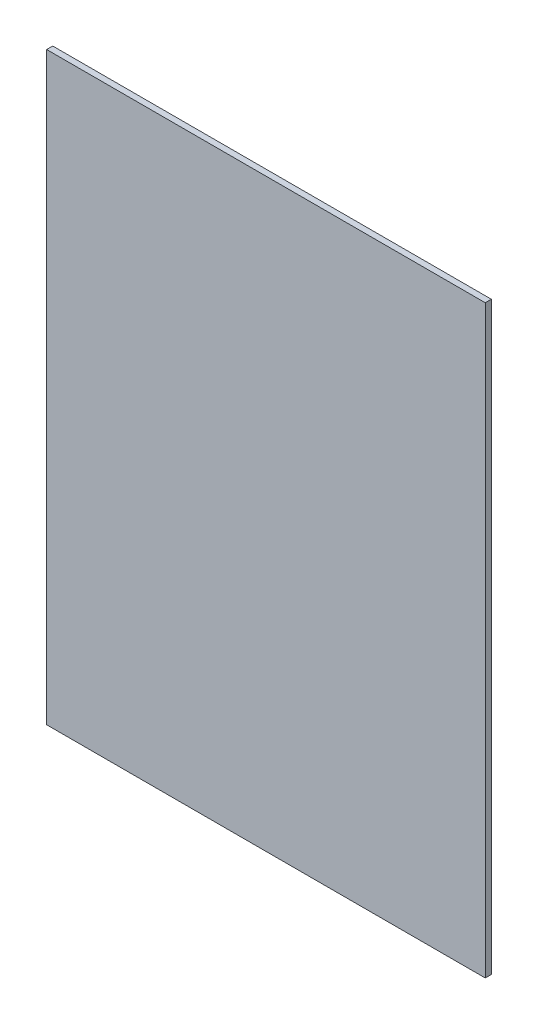
ISO-10303-21;
HEADER;
FILE_DESCRIPTION(('STEP AP214'),'2;1');
FILE_NAME('part.step','',(''),(''),'','','');
FILE_SCHEMA(('AUTOMOTIVE_DESIGN { 1 0 10303 214 1 1 1 1 }'));
ENDSEC;
DATA;
#1=APPLICATION_CONTEXT('core data for automotive mechanical design processes');
#2=APPLICATION_PROTOCOL_DEFINITION('international standard','automotive_design',2000,#1);
#3=PRODUCT_CONTEXT('',#1,'mechanical');
#4=PRODUCT('Part','Part','',(#3));
#5=PRODUCT_RELATED_PRODUCT_CATEGORY('part','',(#4));
#6=PRODUCT_DEFINITION_FORMATION('','',#4);
#7=PRODUCT_DEFINITION_CONTEXT('part definition',#1,'design');
#8=PRODUCT_DEFINITION('design','',#6,#7);
#9=PRODUCT_DEFINITION_SHAPE('','',#8);
#10=(LENGTH_UNIT() NAMED_UNIT(*) SI_UNIT(.MILLI.,.METRE.));
#11=(NAMED_UNIT(*) PLANE_ANGLE_UNIT() SI_UNIT($,.RADIAN.));
#12=(NAMED_UNIT(*) SI_UNIT($,.STERADIAN.) SOLID_ANGLE_UNIT());
#13=UNCERTAINTY_MEASURE_WITH_UNIT(LENGTH_MEASURE(1.E-05),#10,'distance_accuracy_value','');
#14=(GEOMETRIC_REPRESENTATION_CONTEXT(3) GLOBAL_UNCERTAINTY_ASSIGNED_CONTEXT((#13)) GLOBAL_UNIT_ASSIGNED_CONTEXT((#10,
#11,#12)) REPRESENTATION_CONTEXT('',''));
#15=CARTESIAN_POINT('',(0.,0.,0.));
#16=DIRECTION('',(0.,0.,1.));
#17=DIRECTION('',(1.,0.,0.));
#18=AXIS2_PLACEMENT_3D('',#15,#16,#17);
#19=CARTESIAN_POINT('',(0.,0.,19.05));
#20=DIRECTION('',(1.,0.,0.));
#21=DIRECTION('',(0.,1.,0.));
#22=AXIS2_PLACEMENT_3D('',#19,#20,#21);
#23=PLANE('',#22);
#24=DIRECTION('',(0.,-1.,0.));
#25=VECTOR('',#24,1.);
#26=CARTESIAN_POINT('',(0.,0.,0.));
#27=LINE('',#26,#25);
#28=CARTESIAN_POINT('',(0.,0.,0.));
#29=VERTEX_POINT('',#28);
#30=CARTESIAN_POINT('',(2.23963406628068E-13,-1828.8,0.));
#31=VERTEX_POINT('',#30);
#32=EDGE_CURVE('E96',#29,#31,#27,.T.);
#33=ORIENTED_EDGE('',*,*,#32,.T.);
#34=DIRECTION('',(0.,0.,-1.));
#35=VECTOR('',#34,1.);
#36=CARTESIAN_POINT('',(2.23963406628068E-13,-1828.8,19.05));
#37=LINE('',#36,#35);
#38=CARTESIAN_POINT('',(2.23963406628068E-13,-1828.8,19.05));
#39=VERTEX_POINT('',#38);
#40=EDGE_CURVE('E11',#39,#31,#37,.T.);
#41=ORIENTED_EDGE('',*,*,#40,.F.);
#42=DIRECTION('',(0.,-1.,0.));
#43=VECTOR('',#42,1.);
#44=CARTESIAN_POINT('',(0.,0.,19.05));
#45=LINE('',#44,#43);
#46=CARTESIAN_POINT('',(0.,0.,19.05));
#47=VERTEX_POINT('',#46);
#48=EDGE_CURVE('E84',#47,#39,#45,.T.);
#49=ORIENTED_EDGE('',*,*,#48,.F.);
#50=DIRECTION('',(0.,0.,-1.));
#51=VECTOR('',#50,1.);
#52=CARTESIAN_POINT('',(0.,0.,19.05));
#53=LINE('',#52,#51);
#54=EDGE_CURVE('E92',#47,#29,#53,.T.);
#55=ORIENTED_EDGE('',*,*,#54,.T.);
#56=EDGE_LOOP('',(#33,#41,#49,#55));
#57=FACE_BOUND('',#56,.T.);
#58=ADVANCED_FACE('F33',(#57),#23,.F.);
#59=CARTESIAN_POINT('',(2.23963406628068E-13,-1828.8,19.05));
#60=DIRECTION('',(0.,1.,0.));
#61=DIRECTION('',(0.,0.,1.));
#62=AXIS2_PLACEMENT_3D('',#59,#60,#61);
#63=PLANE('',#62);
#64=DIRECTION('',(1.,0.,0.));
#65=VECTOR('',#64,1.);
#66=CARTESIAN_POINT('',(2.23963406628068E-13,-1828.8,0.));
#67=LINE('',#66,#65);
#68=CARTESIAN_POINT('',(1371.6,-1828.8,0.));
#69=VERTEX_POINT('',#68);
#70=EDGE_CURVE('E88',#31,#69,#67,.T.);
#71=ORIENTED_EDGE('',*,*,#70,.T.);
#72=DIRECTION('',(0.,0.,-1.));
#73=VECTOR('',#72,1.);
#74=CARTESIAN_POINT('',(1371.6,-1828.8,19.05));
#75=LINE('',#74,#73);
#76=CARTESIAN_POINT('',(1371.6,-1828.8,19.05));
#77=VERTEX_POINT('',#76);
#78=EDGE_CURVE('E41',#77,#69,#75,.T.);
#79=ORIENTED_EDGE('',*,*,#78,.F.);
#80=DIRECTION('',(1.,0.,0.));
#81=VECTOR('',#80,1.);
#82=CARTESIAN_POINT('',(2.23963406628068E-13,-1828.8,19.05));
#83=LINE('',#82,#81);
#84=EDGE_CURVE('E79',#39,#77,#83,.T.);
#85=ORIENTED_EDGE('',*,*,#84,.F.);
#86=ORIENTED_EDGE('',*,*,#40,.T.);
#87=EDGE_LOOP('',(#71,#79,#85,#86));
#88=FACE_BOUND('',#87,.T.);
#89=ADVANCED_FACE('F87',(#88),#63,.F.);
#90=CARTESIAN_POINT('',(1371.6,0.,19.05));
#91=DIRECTION('',(-1.,0.,0.));
#92=DIRECTION('',(0.,-1.,0.));
#93=AXIS2_PLACEMENT_3D('',#90,#91,#92);
#94=PLANE('',#93);
#95=DIRECTION('',(0.,1.,0.));
#96=VECTOR('',#95,1.);
#97=CARTESIAN_POINT('',(1371.6,0.,0.));
#98=LINE('',#97,#96);
#99=CARTESIAN_POINT('',(1371.6,0.,0.));
#100=VERTEX_POINT('',#99);
#101=EDGE_CURVE('E66',#69,#100,#98,.T.);
#102=ORIENTED_EDGE('',*,*,#101,.T.);
#103=DIRECTION('',(0.,0.,-1.));
#104=VECTOR('',#103,1.);
#105=CARTESIAN_POINT('',(1371.6,0.,19.05));
#106=LINE('',#105,#104);
#107=CARTESIAN_POINT('',(1371.6,0.,19.05));
#108=VERTEX_POINT('',#107);
#109=EDGE_CURVE('E89',#108,#100,#106,.T.);
#110=ORIENTED_EDGE('',*,*,#109,.F.);
#111=DIRECTION('',(0.,1.,0.));
#112=VECTOR('',#111,1.);
#113=CARTESIAN_POINT('',(1371.6,0.,19.05));
#114=LINE('',#113,#112);
#115=EDGE_CURVE('E82',#77,#108,#114,.T.);
#116=ORIENTED_EDGE('',*,*,#115,.F.);
#117=ORIENTED_EDGE('',*,*,#78,.T.);
#118=EDGE_LOOP('',(#102,#110,#116,#117));
#119=FACE_BOUND('',#118,.T.);
#120=ADVANCED_FACE('F90',(#119),#94,.F.);
#121=CARTESIAN_POINT('',(0.,0.,19.05));
#122=DIRECTION('',(0.,-1.,0.));
#123=DIRECTION('',(0.,0.,-1.));
#124=AXIS2_PLACEMENT_3D('',#121,#122,#123);
#125=PLANE('',#124);
#126=DIRECTION('',(-1.,0.,0.));
#127=VECTOR('',#126,1.);
#128=CARTESIAN_POINT('',(0.,0.,0.));
#129=LINE('',#128,#127);
#130=EDGE_CURVE('E72',#100,#29,#129,.T.);
#131=ORIENTED_EDGE('',*,*,#130,.T.);
#132=ORIENTED_EDGE('',*,*,#54,.F.);
#133=DIRECTION('',(-1.,0.,0.));
#134=VECTOR('',#133,1.);
#135=CARTESIAN_POINT('',(0.,0.,19.05));
#136=LINE('',#135,#134);
#137=EDGE_CURVE('E49',#108,#47,#136,.T.);
#138=ORIENTED_EDGE('',*,*,#137,.F.);
#139=ORIENTED_EDGE('',*,*,#109,.T.);
#140=EDGE_LOOP('',(#131,#132,#138,#139));
#141=FACE_BOUND('',#140,.T.);
#142=ADVANCED_FACE('F103',(#141),#125,.F.);
#143=CARTESIAN_POINT('',(0.,0.,19.05));
#144=DIRECTION('',(0.,0.,1.));
#145=DIRECTION('',(1.,0.,0.));
#146=AXIS2_PLACEMENT_3D('',#143,#144,#145);
#147=PLANE('',#146);
#148=ORIENTED_EDGE('',*,*,#48,.T.);
#149=ORIENTED_EDGE('',*,*,#84,.T.);
#150=ORIENTED_EDGE('',*,*,#115,.T.);
#151=ORIENTED_EDGE('',*,*,#137,.T.);
#152=EDGE_LOOP('',(#148,#149,#150,#151));
#153=FACE_BOUND('',#152,.T.);
#154=ADVANCED_FACE('F80',(#153),#147,.T.);
#155=CARTESIAN_POINT('',(0.,0.,0.));
#156=DIRECTION('',(0.,0.,1.));
#157=DIRECTION('',(1.,0.,0.));
#158=AXIS2_PLACEMENT_3D('',#155,#156,#157);
#159=PLANE('',#158);
#160=ORIENTED_EDGE('',*,*,#32,.F.);
#161=ORIENTED_EDGE('',*,*,#130,.F.);
#162=ORIENTED_EDGE('',*,*,#101,.F.);
#163=ORIENTED_EDGE('',*,*,#70,.F.);
#164=EDGE_LOOP('',(#160,#161,#162,#163));
#165=FACE_BOUND('',#164,.T.);
#166=ADVANCED_FACE('F106',(#165),#159,.F.);
#167=CLOSED_SHELL('',(#58,#89,#120,#142,#154,#166));
#168=MANIFOLD_SOLID_BREP('B2',#167);
#169=ADVANCED_BREP_SHAPE_REPRESENTATION('',(#18,#168),#14);
#170=SHAPE_DEFINITION_REPRESENTATION(#9,#169);
ENDSEC;
END-ISO-10303-21;
